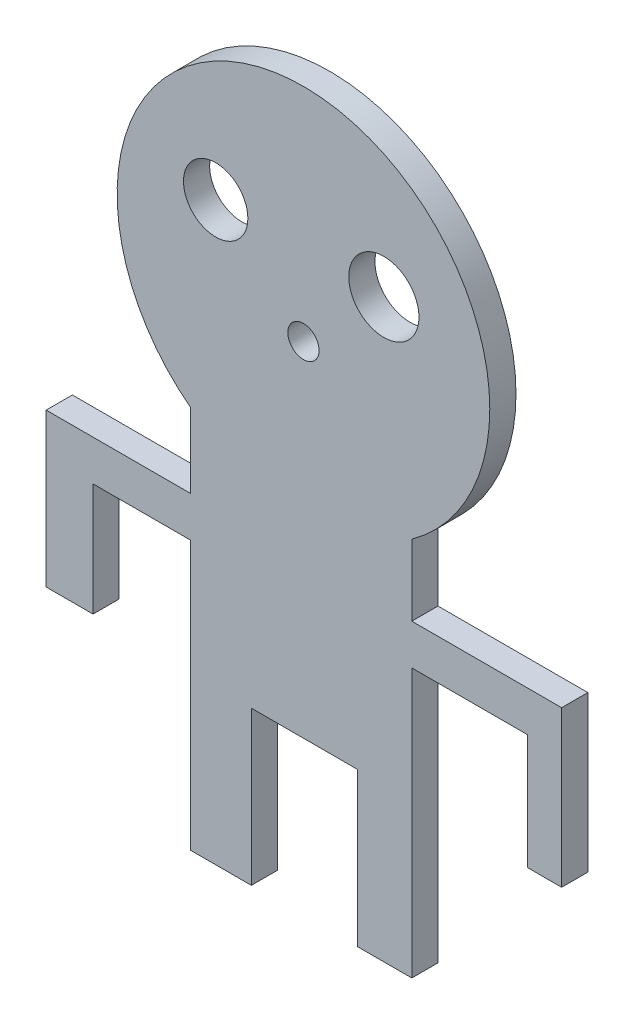
ISO-10303-21;
HEADER;
FILE_DESCRIPTION(('STEP AP214'),'2;1');
FILE_NAME('part.step','',(''),(''),'','','');
FILE_SCHEMA(('AUTOMOTIVE_DESIGN { 1 0 10303 214 1 1 1 1 }'));
ENDSEC;
DATA;
#1=APPLICATION_CONTEXT('core data for automotive mechanical design processes');
#2=APPLICATION_PROTOCOL_DEFINITION('international standard','automotive_design',2000,#1);
#3=PRODUCT_CONTEXT('',#1,'mechanical');
#4=PRODUCT('Part','Part','',(#3));
#5=PRODUCT_RELATED_PRODUCT_CATEGORY('part','',(#4));
#6=PRODUCT_DEFINITION_FORMATION('','',#4);
#7=PRODUCT_DEFINITION_CONTEXT('part definition',#1,'design');
#8=PRODUCT_DEFINITION('design','',#6,#7);
#9=PRODUCT_DEFINITION_SHAPE('','',#8);
#10=(LENGTH_UNIT() NAMED_UNIT(*) SI_UNIT(.MILLI.,.METRE.));
#11=(NAMED_UNIT(*) PLANE_ANGLE_UNIT() SI_UNIT($,.RADIAN.));
#12=(NAMED_UNIT(*) SI_UNIT($,.STERADIAN.) SOLID_ANGLE_UNIT());
#13=UNCERTAINTY_MEASURE_WITH_UNIT(LENGTH_MEASURE(1.E-05),#10,'distance_accuracy_value','');
#14=(GEOMETRIC_REPRESENTATION_CONTEXT(3) GLOBAL_UNCERTAINTY_ASSIGNED_CONTEXT((#13)) GLOBAL_UNIT_ASSIGNED_CONTEXT((#10,
#11,#12)) REPRESENTATION_CONTEXT('',''));
#15=CARTESIAN_POINT('',(0.,0.,0.));
#16=DIRECTION('',(0.,0.,1.));
#17=DIRECTION('',(1.,0.,0.));
#18=AXIS2_PLACEMENT_3D('',#15,#16,#17);
#19=CARTESIAN_POINT('',(0.,0.,10.));
#20=DIRECTION('',(0.,0.,1.));
#21=DIRECTION('',(1.,0.,0.));
#22=AXIS2_PLACEMENT_3D('',#19,#20,#21);
#23=PLANE('',#22);
#24=CARTESIAN_POINT('',(30.6884901447946,16.8513640326862,10.));
#25=DIRECTION('',(0.,0.,1.));
#26=DIRECTION('',(1.,0.,0.));
#27=AXIS2_PLACEMENT_3D('',#24,#25,#26);
#28=CIRCLE('',#27,13.4023424425975);
#29=CARTESIAN_POINT('',(44.0908325873921,16.8513640326862,10.));
#30=VERTEX_POINT('',#29);
#31=EDGE_CURVE('E458',#30,#30,#28,.T.);
#32=ORIENTED_EDGE('',*,*,#31,.F.);
#33=EDGE_LOOP('',(#32));
#34=FACE_BOUND('',#33,.T.);
#35=CARTESIAN_POINT('',(0.,0.,10.));
#36=DIRECTION('',(0.,0.,1.));
#37=DIRECTION('',(1.,0.,0.));
#38=AXIS2_PLACEMENT_3D('',#35,#36,#37);
#39=CIRCLE('',#38,71.1280028052425);
#40=CARTESIAN_POINT('',(41.3499882728577,-57.8737527113727,10.));
#41=VERTEX_POINT('',#40);
#42=CARTESIAN_POINT('',(-43.1667082599356,-56.5316555662771,10.));
#43=VERTEX_POINT('',#42);
#44=EDGE_CURVE('E275',#41,#43,#39,.T.);
#45=ORIENTED_EDGE('',*,*,#44,.T.);
#46=DIRECTION('',(0.,-1.,0.));
#47=VECTOR('',#46,1.);
#48=CARTESIAN_POINT('',(-43.1667082599356,-56.5316555662771,10.));
#49=LINE('',#48,#47);
#50=CARTESIAN_POINT('',(-43.1667082599356,-85.0113060817988,10.));
#51=VERTEX_POINT('',#50);
#52=EDGE_CURVE('E136',#43,#51,#49,.T.);
#53=ORIENTED_EDGE('',*,*,#52,.T.);
#54=DIRECTION('',(-1.,0.,0.));
#55=VECTOR('',#54,1.);
#56=CARTESIAN_POINT('',(-43.1667082599356,-85.0113060817988,10.));
#57=LINE('',#56,#55);
#58=CARTESIAN_POINT('',(-98.2179549040455,-85.0113060817988,10.));
#59=VERTEX_POINT('',#58);
#60=EDGE_CURVE('E344',#51,#59,#57,.T.);
#61=ORIENTED_EDGE('',*,*,#60,.T.);
#62=DIRECTION('',(0.,-1.,0.));
#63=VECTOR('',#62,1.);
#64=CARTESIAN_POINT('',(-98.2179549040455,-85.0113060817988,10.));
#65=LINE('',#64,#63);
#66=CARTESIAN_POINT('',(-98.2179549040455,-143.510977861407,10.));
#67=VERTEX_POINT('',#66);
#68=EDGE_CURVE('E363',#59,#67,#65,.T.);
#69=ORIENTED_EDGE('',*,*,#68,.T.);
#70=DIRECTION('',(1.,0.,0.));
#71=VECTOR('',#70,1.);
#72=CARTESIAN_POINT('',(-98.2179549040455,-143.510977861407,10.));
#73=LINE('',#72,#71);
#74=CARTESIAN_POINT('',(-80.3296255168925,-143.510977861407,10.));
#75=VERTEX_POINT('',#74);
#76=EDGE_CURVE('E359',#67,#75,#73,.T.);
#77=ORIENTED_EDGE('',*,*,#76,.T.);
#78=DIRECTION('',(0.,1.,0.));
#79=VECTOR('',#78,1.);
#80=CARTESIAN_POINT('',(-80.3296255168925,-100.459006623722,10.));
#81=LINE('',#80,#79);
#82=CARTESIAN_POINT('',(-80.3296255168925,-100.459006623722,10.));
#83=VERTEX_POINT('',#82);
#84=EDGE_CURVE('E362',#75,#83,#81,.T.);
#85=ORIENTED_EDGE('',*,*,#84,.T.);
#86=DIRECTION('',(1.,0.,0.));
#87=VECTOR('',#86,1.);
#88=CARTESIAN_POINT('',(-43.1667082599356,-100.459006623722,10.));
#89=LINE('',#88,#87);
#90=CARTESIAN_POINT('',(-43.1667082599356,-100.459006623722,10.));
#91=VERTEX_POINT('',#90);
#92=EDGE_CURVE('E367',#83,#91,#89,.T.);
#93=ORIENTED_EDGE('',*,*,#92,.T.);
#94=DIRECTION('',(0.,-1.,0.));
#95=VECTOR('',#94,1.);
#96=CARTESIAN_POINT('',(-43.1667082599356,-100.459006623722,10.));
#97=LINE('',#96,#95);
#98=CARTESIAN_POINT('',(-43.1667082599356,-202.977586364646,10.));
#99=VERTEX_POINT('',#98);
#100=EDGE_CURVE('E374',#91,#99,#97,.T.);
#101=ORIENTED_EDGE('',*,*,#100,.T.);
#102=DIRECTION('',(1.,0.,0.));
#103=VECTOR('',#102,1.);
#104=CARTESIAN_POINT('',(-43.1667082599356,-202.977586364646,10.));
#105=LINE('',#104,#103);
#106=CARTESIAN_POINT('',(-19.8960802900243,-202.977586364646,10.));
#107=VERTEX_POINT('',#106);
#108=EDGE_CURVE('E377',#99,#107,#105,.T.);
#109=ORIENTED_EDGE('',*,*,#108,.T.);
#110=DIRECTION('',(0.,1.,0.));
#111=VECTOR('',#110,1.);
#112=CARTESIAN_POINT('',(-19.8960802900243,-144.386357681167,10.));
#113=LINE('',#112,#111);
#114=CARTESIAN_POINT('',(-19.8960802900243,-144.386357681167,10.));
#115=VERTEX_POINT('',#114);
#116=EDGE_CURVE('E380',#107,#115,#113,.T.);
#117=ORIENTED_EDGE('',*,*,#116,.T.);
#118=DIRECTION('',(1.,0.,0.));
#119=VECTOR('',#118,1.);
#120=CARTESIAN_POINT('',(-19.8960802900243,-144.386357681167,10.));
#121=LINE('',#120,#119);
#122=CARTESIAN_POINT('',(20.7152621024311,-144.386357681167,10.));
#123=VERTEX_POINT('',#122);
#124=EDGE_CURVE('E383',#115,#123,#121,.T.);
#125=ORIENTED_EDGE('',*,*,#124,.T.);
#126=DIRECTION('',(0.,-1.,0.));
#127=VECTOR('',#126,1.);
#128=CARTESIAN_POINT('',(20.7152621024311,-144.386357681167,10.));
#129=LINE('',#128,#127);
#130=CARTESIAN_POINT('',(20.7152621024311,-202.977586364646,10.));
#131=VERTEX_POINT('',#130);
#132=EDGE_CURVE('E386',#123,#131,#129,.T.);
#133=ORIENTED_EDGE('',*,*,#132,.T.);
#134=DIRECTION('',(1.,0.,0.));
#135=VECTOR('',#134,1.);
#136=CARTESIAN_POINT('',(41.3499882728577,-202.977586364646,10.));
#137=LINE('',#136,#135);
#138=CARTESIAN_POINT('',(41.3499882728577,-202.977586364646,10.));
#139=VERTEX_POINT('',#138);
#140=EDGE_CURVE('E389',#131,#139,#137,.T.);
#141=ORIENTED_EDGE('',*,*,#140,.T.);
#142=DIRECTION('',(0.,1.,0.));
#143=VECTOR('',#142,1.);
#144=CARTESIAN_POINT('',(41.3499882728577,-144.386357681167,10.));
#145=LINE('',#144,#143);
#146=CARTESIAN_POINT('',(41.3499882728577,-100.459006623722,10.));
#147=VERTEX_POINT('',#146);
#148=EDGE_CURVE('E392',#139,#147,#145,.T.);
#149=ORIENTED_EDGE('',*,*,#148,.T.);
#150=DIRECTION('',(1.,0.,0.));
#151=VECTOR('',#150,1.);
#152=CARTESIAN_POINT('',(41.3499882728577,-100.459006623722,10.));
#153=LINE('',#152,#151);
#154=CARTESIAN_POINT('',(85.5000225856338,-100.459006623722,10.));
#155=VERTEX_POINT('',#154);
#156=EDGE_CURVE('E395',#147,#155,#153,.T.);
#157=ORIENTED_EDGE('',*,*,#156,.T.);
#158=DIRECTION('',(0.,-1.,0.));
#159=VECTOR('',#158,1.);
#160=CARTESIAN_POINT('',(85.5000225856338,-100.459006623722,10.));
#161=LINE('',#160,#159);
#162=CARTESIAN_POINT('',(85.5000225856338,-144.386357681167,10.));
#163=VERTEX_POINT('',#162);
#164=EDGE_CURVE('E398',#155,#163,#161,.T.);
#165=ORIENTED_EDGE('',*,*,#164,.T.);
#166=DIRECTION('',(1.,0.,0.));
#167=VECTOR('',#166,1.);
#168=CARTESIAN_POINT('',(98.5536683546373,-144.386357681167,10.));
#169=LINE('',#168,#167);
#170=CARTESIAN_POINT('',(98.5536683546373,-144.386357681167,10.));
#171=VERTEX_POINT('',#170);
#172=EDGE_CURVE('E191',#163,#171,#169,.T.);
#173=ORIENTED_EDGE('',*,*,#172,.T.);
#174=DIRECTION('',(0.,1.,0.));
#175=VECTOR('',#174,1.);
#176=CARTESIAN_POINT('',(98.5536683546373,-100.459006623722,10.));
#177=LINE('',#176,#175);
#178=CARTESIAN_POINT('',(98.5536683546373,-85.0113060817988,10.));
#179=VERTEX_POINT('',#178);
#180=EDGE_CURVE('E185',#171,#179,#177,.T.);
#181=ORIENTED_EDGE('',*,*,#180,.T.);
#182=DIRECTION('',(-1.,0.,0.));
#183=VECTOR('',#182,1.);
#184=CARTESIAN_POINT('',(41.3499882728577,-85.0113060817988,10.));
#185=LINE('',#184,#183);
#186=CARTESIAN_POINT('',(41.3499882728577,-85.0113060817988,10.));
#187=VERTEX_POINT('',#186);
#188=EDGE_CURVE('E189',#179,#187,#185,.T.);
#189=ORIENTED_EDGE('',*,*,#188,.T.);
#190=DIRECTION('',(0.,1.,0.));
#191=VECTOR('',#190,1.);
#192=CARTESIAN_POINT('',(41.3499882728577,-57.8737527113727,10.));
#193=LINE('',#192,#191);
#194=EDGE_CURVE('E57',#187,#41,#193,.T.);
#195=ORIENTED_EDGE('',*,*,#194,.T.);
#196=EDGE_LOOP('',(#45,#53,#61,#69,#77,#85,#93,#101,#109,#117,#125,#133,#141,#149,#157,#165,
#173,#181,#189,#195));
#197=FACE_BOUND('',#196,.T.);
#198=CARTESIAN_POINT('',(-33.5174208042074,16.8513640326862,10.));
#199=DIRECTION('',(0.,0.,1.));
#200=DIRECTION('',(1.,0.,0.));
#201=AXIS2_PLACEMENT_3D('',#198,#199,#200);
#202=CIRCLE('',#201,12.2880186326441);
#203=CARTESIAN_POINT('',(-21.2294021715633,16.8513640326862,10.));
#204=VERTEX_POINT('',#203);
#205=EDGE_CURVE('E217',#204,#204,#202,.T.);
#206=ORIENTED_EDGE('',*,*,#205,.F.);
#207=EDGE_LOOP('',(#206));
#208=FACE_BOUND('',#207,.T.);
#209=CARTESIAN_POINT('',(0.,-13.2377529065141,10.));
#210=DIRECTION('',(0.,0.,1.));
#211=DIRECTION('',(1.,0.,0.));
#212=AXIS2_PLACEMENT_3D('',#209,#210,#211);
#213=CIRCLE('',#212,5.96665513408762);
#214=CARTESIAN_POINT('',(5.96665513408762,-13.2377529065141,10.));
#215=VERTEX_POINT('',#214);
#216=EDGE_CURVE('E447',#215,#215,#213,.T.);
#217=ORIENTED_EDGE('',*,*,#216,.F.);
#218=EDGE_LOOP('',(#217));
#219=FACE_BOUND('',#218,.T.);
#220=ADVANCED_FACE('F39',(#34,#197,#208,#219),#23,.T.);
#221=CARTESIAN_POINT('',(0.,0.,0.));
#222=DIRECTION('',(0.,0.,1.));
#223=DIRECTION('',(1.,0.,0.));
#224=AXIS2_PLACEMENT_3D('',#221,#222,#223);
#225=PLANE('',#224);
#226=CARTESIAN_POINT('',(0.,0.,0.));
#227=DIRECTION('',(0.,0.,1.));
#228=DIRECTION('',(1.,0.,0.));
#229=AXIS2_PLACEMENT_3D('',#226,#227,#228);
#230=CIRCLE('',#229,71.1280028052425);
#231=CARTESIAN_POINT('',(41.3499882728577,-57.8737527113727,0.));
#232=VERTEX_POINT('',#231);
#233=CARTESIAN_POINT('',(-43.1667082599356,-56.5316555662771,0.));
#234=VERTEX_POINT('',#233);
#235=EDGE_CURVE('E212',#232,#234,#230,.T.);
#236=ORIENTED_EDGE('',*,*,#235,.F.);
#237=DIRECTION('',(0.,1.,0.));
#238=VECTOR('',#237,1.);
#239=CARTESIAN_POINT('',(41.3499882728577,-57.8737527113727,0.));
#240=LINE('',#239,#238);
#241=CARTESIAN_POINT('',(41.3499882728577,-85.0113060817988,0.));
#242=VERTEX_POINT('',#241);
#243=EDGE_CURVE('E128',#242,#232,#240,.T.);
#244=ORIENTED_EDGE('',*,*,#243,.F.);
#245=DIRECTION('',(-1.,0.,0.));
#246=VECTOR('',#245,1.);
#247=CARTESIAN_POINT('',(41.3499882728577,-85.0113060817988,0.));
#248=LINE('',#247,#246);
#249=CARTESIAN_POINT('',(98.5536683546373,-85.0113060817988,0.));
#250=VERTEX_POINT('',#249);
#251=EDGE_CURVE('E122',#250,#242,#248,.T.);
#252=ORIENTED_EDGE('',*,*,#251,.F.);
#253=DIRECTION('',(0.,1.,0.));
#254=VECTOR('',#253,1.);
#255=CARTESIAN_POINT('',(98.5536683546373,-85.0113060817988,0.));
#256=LINE('',#255,#254);
#257=CARTESIAN_POINT('',(98.5536683546373,-144.386357681167,0.));
#258=VERTEX_POINT('',#257);
#259=EDGE_CURVE('E199',#258,#250,#256,.T.);
#260=ORIENTED_EDGE('',*,*,#259,.F.);
#261=DIRECTION('',(1.,0.,0.));
#262=VECTOR('',#261,1.);
#263=CARTESIAN_POINT('',(98.5536683546373,-144.386357681167,0.));
#264=LINE('',#263,#262);
#265=CARTESIAN_POINT('',(85.5000225856338,-144.386357681167,0.));
#266=VERTEX_POINT('',#265);
#267=EDGE_CURVE('E265',#266,#258,#264,.T.);
#268=ORIENTED_EDGE('',*,*,#267,.F.);
#269=DIRECTION('',(0.,-1.,0.));
#270=VECTOR('',#269,1.);
#271=CARTESIAN_POINT('',(85.5000225856338,-100.459006623722,0.));
#272=LINE('',#271,#270);
#273=CARTESIAN_POINT('',(85.5000225856338,-100.459006623722,0.));
#274=VERTEX_POINT('',#273);
#275=EDGE_CURVE('E262',#274,#266,#272,.T.);
#276=ORIENTED_EDGE('',*,*,#275,.F.);
#277=DIRECTION('',(1.,0.,0.));
#278=VECTOR('',#277,1.);
#279=CARTESIAN_POINT('',(41.3499882728577,-100.459006623722,0.));
#280=LINE('',#279,#278);
#281=CARTESIAN_POINT('',(41.3499882728577,-100.459006623722,0.));
#282=VERTEX_POINT('',#281);
#283=EDGE_CURVE('E259',#282,#274,#280,.T.);
#284=ORIENTED_EDGE('',*,*,#283,.F.);
#285=DIRECTION('',(0.,1.,0.));
#286=VECTOR('',#285,1.);
#287=CARTESIAN_POINT('',(41.3499882728577,-100.459006623722,0.));
#288=LINE('',#287,#286);
#289=CARTESIAN_POINT('',(41.3499882728577,-202.977586364646,0.));
#290=VERTEX_POINT('',#289);
#291=EDGE_CURVE('E256',#290,#282,#288,.T.);
#292=ORIENTED_EDGE('',*,*,#291,.F.);
#293=DIRECTION('',(1.,0.,0.));
#294=VECTOR('',#293,1.);
#295=CARTESIAN_POINT('',(41.3499882728577,-202.977586364646,0.));
#296=LINE('',#295,#294);
#297=CARTESIAN_POINT('',(20.7152621024311,-202.977586364646,0.));
#298=VERTEX_POINT('',#297);
#299=EDGE_CURVE('E252',#298,#290,#296,.T.);
#300=ORIENTED_EDGE('',*,*,#299,.F.);
#301=DIRECTION('',(0.,-1.,0.));
#302=VECTOR('',#301,1.);
#303=CARTESIAN_POINT('',(20.7152621024311,-144.386357681167,0.));
#304=LINE('',#303,#302);
#305=CARTESIAN_POINT('',(20.7152621024311,-144.386357681167,0.));
#306=VERTEX_POINT('',#305);
#307=EDGE_CURVE('E249',#306,#298,#304,.T.);
#308=ORIENTED_EDGE('',*,*,#307,.F.);
#309=DIRECTION('',(1.,0.,0.));
#310=VECTOR('',#309,1.);
#311=CARTESIAN_POINT('',(-19.8960802900243,-144.386357681167,0.));
#312=LINE('',#311,#310);
#313=CARTESIAN_POINT('',(-19.8960802900243,-144.386357681167,0.));
#314=VERTEX_POINT('',#313);
#315=EDGE_CURVE('E246',#314,#306,#312,.T.);
#316=ORIENTED_EDGE('',*,*,#315,.F.);
#317=DIRECTION('',(0.,1.,0.));
#318=VECTOR('',#317,1.);
#319=CARTESIAN_POINT('',(-19.8960802900243,-144.386357681167,0.));
#320=LINE('',#319,#318);
#321=CARTESIAN_POINT('',(-19.8960802900243,-202.977586364646,0.));
#322=VERTEX_POINT('',#321);
#323=EDGE_CURVE('E243',#322,#314,#320,.T.);
#324=ORIENTED_EDGE('',*,*,#323,.F.);
#325=DIRECTION('',(1.,0.,0.));
#326=VECTOR('',#325,1.);
#327=CARTESIAN_POINT('',(-43.1667082599356,-202.977586364646,0.));
#328=LINE('',#327,#326);
#329=CARTESIAN_POINT('',(-43.1667082599356,-202.977586364646,0.));
#330=VERTEX_POINT('',#329);
#331=EDGE_CURVE('E240',#330,#322,#328,.T.);
#332=ORIENTED_EDGE('',*,*,#331,.F.);
#333=DIRECTION('',(0.,-1.,0.));
#334=VECTOR('',#333,1.);
#335=CARTESIAN_POINT('',(-43.1667082599356,-144.386357681167,0.));
#336=LINE('',#335,#334);
#337=CARTESIAN_POINT('',(-43.1667082599356,-100.459006623722,0.));
#338=VERTEX_POINT('',#337);
#339=EDGE_CURVE('E237',#338,#330,#336,.T.);
#340=ORIENTED_EDGE('',*,*,#339,.F.);
#341=DIRECTION('',(1.,0.,0.));
#342=VECTOR('',#341,1.);
#343=CARTESIAN_POINT('',(-43.1667082599356,-100.459006623722,0.));
#344=LINE('',#343,#342);
#345=CARTESIAN_POINT('',(-80.3296255168925,-100.459006623722,0.));
#346=VERTEX_POINT('',#345);
#347=EDGE_CURVE('E233',#346,#338,#344,.T.);
#348=ORIENTED_EDGE('',*,*,#347,.F.);
#349=DIRECTION('',(0.,1.,0.));
#350=VECTOR('',#349,1.);
#351=CARTESIAN_POINT('',(-80.3296255168925,-100.459006623722,0.));
#352=LINE('',#351,#350);
#353=CARTESIAN_POINT('',(-80.3296255168925,-143.510977861407,0.));
#354=VERTEX_POINT('',#353);
#355=EDGE_CURVE('E230',#354,#346,#352,.T.);
#356=ORIENTED_EDGE('',*,*,#355,.F.);
#357=DIRECTION('',(1.,0.,0.));
#358=VECTOR('',#357,1.);
#359=CARTESIAN_POINT('',(-98.2179549040455,-143.510977861407,0.));
#360=LINE('',#359,#358);
#361=CARTESIAN_POINT('',(-98.2179549040455,-143.510977861407,0.));
#362=VERTEX_POINT('',#361);
#363=EDGE_CURVE('E227',#362,#354,#360,.T.);
#364=ORIENTED_EDGE('',*,*,#363,.F.);
#365=DIRECTION('',(0.,-1.,0.));
#366=VECTOR('',#365,1.);
#367=CARTESIAN_POINT('',(-98.2179549040455,-100.459006623722,0.));
#368=LINE('',#367,#366);
#369=CARTESIAN_POINT('',(-98.2179549040455,-85.0113060817988,0.));
#370=VERTEX_POINT('',#369);
#371=EDGE_CURVE('E224',#370,#362,#368,.T.);
#372=ORIENTED_EDGE('',*,*,#371,.F.);
#373=DIRECTION('',(-1.,0.,0.));
#374=VECTOR('',#373,1.);
#375=CARTESIAN_POINT('',(-43.1667082599356,-85.0113060817988,0.));
#376=LINE('',#375,#374);
#377=CARTESIAN_POINT('',(-43.1667082599356,-85.0113060817988,0.));
#378=VERTEX_POINT('',#377);
#379=EDGE_CURVE('E220',#378,#370,#376,.T.);
#380=ORIENTED_EDGE('',*,*,#379,.F.);
#381=DIRECTION('',(0.,-1.,0.));
#382=VECTOR('',#381,1.);
#383=CARTESIAN_POINT('',(-43.1667082599356,-56.5316555662771,0.));
#384=LINE('',#383,#382);
#385=EDGE_CURVE('E216',#234,#378,#384,.T.);
#386=ORIENTED_EDGE('',*,*,#385,.F.);
#387=EDGE_LOOP('',(#236,#244,#252,#260,#268,#276,#284,#292,#300,#308,#316,#324,#332,#340,#348,
#356,#364,#372,#380,#386));
#388=FACE_BOUND('',#387,.T.);
#389=CARTESIAN_POINT('',(-33.5174208042074,16.8513640326862,0.));
#390=DIRECTION('',(0.,0.,1.));
#391=DIRECTION('',(1.,0.,0.));
#392=AXIS2_PLACEMENT_3D('',#389,#390,#391);
#393=CIRCLE('',#392,12.2880186326441);
#394=CARTESIAN_POINT('',(-21.2294021715633,16.8513640326862,0.));
#395=VERTEX_POINT('',#394);
#396=EDGE_CURVE('E462',#395,#395,#393,.T.);
#397=ORIENTED_EDGE('',*,*,#396,.T.);
#398=EDGE_LOOP('',(#397));
#399=FACE_BOUND('',#398,.T.);
#400=CARTESIAN_POINT('',(30.6884901447946,16.8513640326862,0.));
#401=DIRECTION('',(0.,0.,1.));
#402=DIRECTION('',(1.,0.,0.));
#403=AXIS2_PLACEMENT_3D('',#400,#401,#402);
#404=CIRCLE('',#403,13.4023424425975);
#405=CARTESIAN_POINT('',(44.0908325873921,16.8513640326862,0.));
#406=VERTEX_POINT('',#405);
#407=EDGE_CURVE('E455',#406,#406,#404,.T.);
#408=ORIENTED_EDGE('',*,*,#407,.T.);
#409=EDGE_LOOP('',(#408));
#410=FACE_BOUND('',#409,.T.);
#411=CARTESIAN_POINT('',(0.,-13.2377529065141,0.));
#412=DIRECTION('',(0.,0.,1.));
#413=DIRECTION('',(1.,0.,0.));
#414=AXIS2_PLACEMENT_3D('',#411,#412,#413);
#415=CIRCLE('',#414,5.96665513408762);
#416=CARTESIAN_POINT('',(5.96665513408762,-13.2377529065141,0.));
#417=VERTEX_POINT('',#416);
#418=EDGE_CURVE('E450',#417,#417,#415,.T.);
#419=ORIENTED_EDGE('',*,*,#418,.T.);
#420=EDGE_LOOP('',(#419));
#421=FACE_BOUND('',#420,.T.);
#422=ADVANCED_FACE('F347',(#388,#399,#410,#421),#225,.F.);
#423=CARTESIAN_POINT('',(0.,0.,10.));
#424=DIRECTION('',(0.,0.,-1.));
#425=DIRECTION('',(-1.,0.,0.));
#426=AXIS2_PLACEMENT_3D('',#423,#424,#425);
#427=CYLINDRICAL_SURFACE('',#426,71.1280028052425);
#428=ORIENTED_EDGE('',*,*,#235,.T.);
#429=DIRECTION('',(0.,0.,-1.));
#430=VECTOR('',#429,1.);
#431=CARTESIAN_POINT('',(-43.1667082599356,-56.5316555662771,10.));
#432=LINE('',#431,#430);
#433=EDGE_CURVE('E11',#43,#234,#432,.T.);
#434=ORIENTED_EDGE('',*,*,#433,.F.);
#435=ORIENTED_EDGE('',*,*,#44,.F.);
#436=DIRECTION('',(0.,0.,-1.));
#437=VECTOR('',#436,1.);
#438=CARTESIAN_POINT('',(41.3499882728577,-57.8737527113727,10.));
#439=LINE('',#438,#437);
#440=EDGE_CURVE('E208',#41,#232,#439,.T.);
#441=ORIENTED_EDGE('',*,*,#440,.T.);
#442=EDGE_LOOP('',(#428,#434,#435,#441));
#443=FACE_BOUND('',#442,.T.);
#444=ADVANCED_FACE('F41',(#443),#427,.T.);
#445=CARTESIAN_POINT('',(-43.1667082599356,-56.5316555662771,10.));
#446=DIRECTION('',(1.,0.,0.));
#447=DIRECTION('',(0.,0.,-1.));
#448=AXIS2_PLACEMENT_3D('',#445,#446,#447);
#449=PLANE('',#448);
#450=ORIENTED_EDGE('',*,*,#385,.T.);
#451=DIRECTION('',(0.,0.,-1.));
#452=VECTOR('',#451,1.);
#453=CARTESIAN_POINT('',(-43.1667082599356,-85.0113060817988,10.));
#454=LINE('',#453,#452);
#455=EDGE_CURVE('E49',#51,#378,#454,.T.);
#456=ORIENTED_EDGE('',*,*,#455,.F.);
#457=ORIENTED_EDGE('',*,*,#52,.F.);
#458=ORIENTED_EDGE('',*,*,#433,.T.);
#459=EDGE_LOOP('',(#450,#456,#457,#458));
#460=FACE_BOUND('',#459,.T.);
#461=ADVANCED_FACE('F654',(#460),#449,.F.);
#462=CARTESIAN_POINT('',(-43.1667082599356,-85.0113060817988,10.));
#463=DIRECTION('',(0.,-1.,0.));
#464=DIRECTION('',(0.,0.,-1.));
#465=AXIS2_PLACEMENT_3D('',#462,#463,#464);
#466=PLANE('',#465);
#467=ORIENTED_EDGE('',*,*,#379,.T.);
#468=DIRECTION('',(0.,0.,-1.));
#469=VECTOR('',#468,1.);
#470=CARTESIAN_POINT('',(-98.2179549040455,-85.0113060817988,10.));
#471=LINE('',#470,#469);
#472=EDGE_CURVE('E334',#59,#370,#471,.T.);
#473=ORIENTED_EDGE('',*,*,#472,.F.);
#474=ORIENTED_EDGE('',*,*,#60,.F.);
#475=ORIENTED_EDGE('',*,*,#455,.T.);
#476=EDGE_LOOP('',(#467,#473,#474,#475));
#477=FACE_BOUND('',#476,.T.);
#478=ADVANCED_FACE('F342',(#477),#466,.F.);
#479=CARTESIAN_POINT('',(-98.2179549040455,-100.459006623722,10.));
#480=DIRECTION('',(1.,0.,0.));
#481=DIRECTION('',(0.,0.,-1.));
#482=AXIS2_PLACEMENT_3D('',#479,#480,#481);
#483=PLANE('',#482);
#484=ORIENTED_EDGE('',*,*,#371,.T.);
#485=DIRECTION('',(0.,0.,-1.));
#486=VECTOR('',#485,1.);
#487=CARTESIAN_POINT('',(-98.2179549040455,-143.510977861407,10.));
#488=LINE('',#487,#486);
#489=EDGE_CURVE('E330',#67,#362,#488,.T.);
#490=ORIENTED_EDGE('',*,*,#489,.F.);
#491=ORIENTED_EDGE('',*,*,#68,.F.);
#492=ORIENTED_EDGE('',*,*,#472,.T.);
#493=EDGE_LOOP('',(#484,#490,#491,#492));
#494=FACE_BOUND('',#493,.T.);
#495=ADVANCED_FACE('F353',(#494),#483,.F.);
#496=CARTESIAN_POINT('',(-98.2179549040455,-143.510977861407,10.));
#497=DIRECTION('',(0.,1.,0.));
#498=DIRECTION('',(0.,0.,1.));
#499=AXIS2_PLACEMENT_3D('',#496,#497,#498);
#500=PLANE('',#499);
#501=ORIENTED_EDGE('',*,*,#363,.T.);
#502=DIRECTION('',(0.,0.,-1.));
#503=VECTOR('',#502,1.);
#504=CARTESIAN_POINT('',(-80.3296255168925,-143.510977861407,10.));
#505=LINE('',#504,#503);
#506=EDGE_CURVE('E326',#75,#354,#505,.T.);
#507=ORIENTED_EDGE('',*,*,#506,.F.);
#508=ORIENTED_EDGE('',*,*,#76,.F.);
#509=ORIENTED_EDGE('',*,*,#489,.T.);
#510=EDGE_LOOP('',(#501,#507,#508,#509));
#511=FACE_BOUND('',#510,.T.);
#512=ADVANCED_FACE('F357',(#511),#500,.F.);
#513=CARTESIAN_POINT('',(-80.3296255168925,-100.459006623722,10.));
#514=DIRECTION('',(-1.,0.,0.));
#515=DIRECTION('',(0.,0.,1.));
#516=AXIS2_PLACEMENT_3D('',#513,#514,#515);
#517=PLANE('',#516);
#518=ORIENTED_EDGE('',*,*,#355,.T.);
#519=DIRECTION('',(0.,0.,-1.));
#520=VECTOR('',#519,1.);
#521=CARTESIAN_POINT('',(-80.3296255168925,-100.459006623722,10.));
#522=LINE('',#521,#520);
#523=EDGE_CURVE('E322',#83,#346,#522,.T.);
#524=ORIENTED_EDGE('',*,*,#523,.F.);
#525=ORIENTED_EDGE('',*,*,#84,.F.);
#526=ORIENTED_EDGE('',*,*,#506,.T.);
#527=EDGE_LOOP('',(#518,#524,#525,#526));
#528=FACE_BOUND('',#527,.T.);
#529=ADVANCED_FACE('F618',(#528),#517,.F.);
#530=CARTESIAN_POINT('',(-43.1667082599356,-100.459006623722,10.));
#531=DIRECTION('',(0.,1.,0.));
#532=DIRECTION('',(0.,0.,1.));
#533=AXIS2_PLACEMENT_3D('',#530,#531,#532);
#534=PLANE('',#533);
#535=ORIENTED_EDGE('',*,*,#347,.T.);
#536=DIRECTION('',(0.,0.,-1.));
#537=VECTOR('',#536,1.);
#538=CARTESIAN_POINT('',(-43.1667082599356,-100.459006623722,10.));
#539=LINE('',#538,#537);
#540=EDGE_CURVE('E318',#91,#338,#539,.T.);
#541=ORIENTED_EDGE('',*,*,#540,.F.);
#542=ORIENTED_EDGE('',*,*,#92,.F.);
#543=ORIENTED_EDGE('',*,*,#523,.T.);
#544=EDGE_LOOP('',(#535,#541,#542,#543));
#545=FACE_BOUND('',#544,.T.);
#546=ADVANCED_FACE('F607',(#545),#534,.F.);
#547=CARTESIAN_POINT('',(-43.1667082599356,-144.386357681167,10.));
#548=DIRECTION('',(1.,0.,0.));
#549=DIRECTION('',(0.,0.,-1.));
#550=AXIS2_PLACEMENT_3D('',#547,#548,#549);
#551=PLANE('',#550);
#552=ORIENTED_EDGE('',*,*,#339,.T.);
#553=DIRECTION('',(0.,0.,-1.));
#554=VECTOR('',#553,1.);
#555=CARTESIAN_POINT('',(-43.1667082599356,-202.977586364646,10.));
#556=LINE('',#555,#554);
#557=EDGE_CURVE('E314',#99,#330,#556,.T.);
#558=ORIENTED_EDGE('',*,*,#557,.F.);
#559=ORIENTED_EDGE('',*,*,#100,.F.);
#560=ORIENTED_EDGE('',*,*,#540,.T.);
#561=EDGE_LOOP('',(#552,#558,#559,#560));
#562=FACE_BOUND('',#561,.T.);
#563=ADVANCED_FACE('F597',(#562),#551,.F.);
#564=CARTESIAN_POINT('',(-43.1667082599356,-202.977586364646,10.));
#565=DIRECTION('',(0.,1.,0.));
#566=DIRECTION('',(0.,0.,1.));
#567=AXIS2_PLACEMENT_3D('',#564,#565,#566);
#568=PLANE('',#567);
#569=ORIENTED_EDGE('',*,*,#331,.T.);
#570=DIRECTION('',(0.,0.,-1.));
#571=VECTOR('',#570,1.);
#572=CARTESIAN_POINT('',(-19.8960802900243,-202.977586364646,10.));
#573=LINE('',#572,#571);
#574=EDGE_CURVE('E310',#107,#322,#573,.T.);
#575=ORIENTED_EDGE('',*,*,#574,.F.);
#576=ORIENTED_EDGE('',*,*,#108,.F.);
#577=ORIENTED_EDGE('',*,*,#557,.T.);
#578=EDGE_LOOP('',(#569,#575,#576,#577));
#579=FACE_BOUND('',#578,.T.);
#580=ADVANCED_FACE('F587',(#579),#568,.F.);
#581=CARTESIAN_POINT('',(-19.8960802900243,-144.386357681167,10.));
#582=DIRECTION('',(-1.,0.,0.));
#583=DIRECTION('',(0.,0.,1.));
#584=AXIS2_PLACEMENT_3D('',#581,#582,#583);
#585=PLANE('',#584);
#586=ORIENTED_EDGE('',*,*,#323,.T.);
#587=DIRECTION('',(0.,0.,-1.));
#588=VECTOR('',#587,1.);
#589=CARTESIAN_POINT('',(-19.8960802900243,-144.386357681167,10.));
#590=LINE('',#589,#588);
#591=EDGE_CURVE('E306',#115,#314,#590,.T.);
#592=ORIENTED_EDGE('',*,*,#591,.F.);
#593=ORIENTED_EDGE('',*,*,#116,.F.);
#594=ORIENTED_EDGE('',*,*,#574,.T.);
#595=EDGE_LOOP('',(#586,#592,#593,#594));
#596=FACE_BOUND('',#595,.T.);
#597=ADVANCED_FACE('F577',(#596),#585,.F.);
#598=CARTESIAN_POINT('',(-19.8960802900243,-144.386357681167,10.));
#599=DIRECTION('',(0.,1.,0.));
#600=DIRECTION('',(0.,0.,1.));
#601=AXIS2_PLACEMENT_3D('',#598,#599,#600);
#602=PLANE('',#601);
#603=ORIENTED_EDGE('',*,*,#315,.T.);
#604=DIRECTION('',(0.,0.,-1.));
#605=VECTOR('',#604,1.);
#606=CARTESIAN_POINT('',(20.7152621024311,-144.386357681167,10.));
#607=LINE('',#606,#605);
#608=EDGE_CURVE('E302',#123,#306,#607,.T.);
#609=ORIENTED_EDGE('',*,*,#608,.F.);
#610=ORIENTED_EDGE('',*,*,#124,.F.);
#611=ORIENTED_EDGE('',*,*,#591,.T.);
#612=EDGE_LOOP('',(#603,#609,#610,#611));
#613=FACE_BOUND('',#612,.T.);
#614=ADVANCED_FACE('F567',(#613),#602,.F.);
#615=CARTESIAN_POINT('',(20.7152621024311,-144.386357681167,10.));
#616=DIRECTION('',(1.,0.,0.));
#617=DIRECTION('',(0.,0.,-1.));
#618=AXIS2_PLACEMENT_3D('',#615,#616,#617);
#619=PLANE('',#618);
#620=ORIENTED_EDGE('',*,*,#307,.T.);
#621=DIRECTION('',(0.,0.,-1.));
#622=VECTOR('',#621,1.);
#623=CARTESIAN_POINT('',(20.7152621024311,-202.977586364646,10.));
#624=LINE('',#623,#622);
#625=EDGE_CURVE('E298',#131,#298,#624,.T.);
#626=ORIENTED_EDGE('',*,*,#625,.F.);
#627=ORIENTED_EDGE('',*,*,#132,.F.);
#628=ORIENTED_EDGE('',*,*,#608,.T.);
#629=EDGE_LOOP('',(#620,#626,#627,#628));
#630=FACE_BOUND('',#629,.T.);
#631=ADVANCED_FACE('F557',(#630),#619,.F.);
#632=CARTESIAN_POINT('',(41.3499882728577,-202.977586364646,10.));
#633=DIRECTION('',(0.,1.,0.));
#634=DIRECTION('',(0.,0.,1.));
#635=AXIS2_PLACEMENT_3D('',#632,#633,#634);
#636=PLANE('',#635);
#637=ORIENTED_EDGE('',*,*,#299,.T.);
#638=DIRECTION('',(0.,0.,-1.));
#639=VECTOR('',#638,1.);
#640=CARTESIAN_POINT('',(41.3499882728577,-202.977586364646,10.));
#641=LINE('',#640,#639);
#642=EDGE_CURVE('E294',#139,#290,#641,.T.);
#643=ORIENTED_EDGE('',*,*,#642,.F.);
#644=ORIENTED_EDGE('',*,*,#140,.F.);
#645=ORIENTED_EDGE('',*,*,#625,.T.);
#646=EDGE_LOOP('',(#637,#643,#644,#645));
#647=FACE_BOUND('',#646,.T.);
#648=ADVANCED_FACE('F546',(#647),#636,.F.);
#649=CARTESIAN_POINT('',(41.3499882728577,-100.459006623722,10.));
#650=DIRECTION('',(-1.,0.,0.));
#651=DIRECTION('',(0.,0.,1.));
#652=AXIS2_PLACEMENT_3D('',#649,#650,#651);
#653=PLANE('',#652);
#654=ORIENTED_EDGE('',*,*,#291,.T.);
#655=DIRECTION('',(0.,0.,-1.));
#656=VECTOR('',#655,1.);
#657=CARTESIAN_POINT('',(41.3499882728577,-100.459006623722,10.));
#658=LINE('',#657,#656);
#659=EDGE_CURVE('E290',#147,#282,#658,.T.);
#660=ORIENTED_EDGE('',*,*,#659,.F.);
#661=ORIENTED_EDGE('',*,*,#148,.F.);
#662=ORIENTED_EDGE('',*,*,#642,.T.);
#663=EDGE_LOOP('',(#654,#660,#661,#662));
#664=FACE_BOUND('',#663,.T.);
#665=ADVANCED_FACE('F536',(#664),#653,.F.);
#666=CARTESIAN_POINT('',(41.3499882728577,-100.459006623722,10.));
#667=DIRECTION('',(0.,1.,0.));
#668=DIRECTION('',(0.,0.,1.));
#669=AXIS2_PLACEMENT_3D('',#666,#667,#668);
#670=PLANE('',#669);
#671=ORIENTED_EDGE('',*,*,#283,.T.);
#672=DIRECTION('',(0.,0.,-1.));
#673=VECTOR('',#672,1.);
#674=CARTESIAN_POINT('',(85.5000225856338,-100.459006623722,10.));
#675=LINE('',#674,#673);
#676=EDGE_CURVE('E286',#155,#274,#675,.T.);
#677=ORIENTED_EDGE('',*,*,#676,.F.);
#678=ORIENTED_EDGE('',*,*,#156,.F.);
#679=ORIENTED_EDGE('',*,*,#659,.T.);
#680=EDGE_LOOP('',(#671,#677,#678,#679));
#681=FACE_BOUND('',#680,.T.);
#682=ADVANCED_FACE('F527',(#681),#670,.F.);
#683=CARTESIAN_POINT('',(85.5000225856338,-100.459006623722,10.));
#684=DIRECTION('',(1.,0.,0.));
#685=DIRECTION('',(0.,0.,-1.));
#686=AXIS2_PLACEMENT_3D('',#683,#684,#685);
#687=PLANE('',#686);
#688=ORIENTED_EDGE('',*,*,#275,.T.);
#689=DIRECTION('',(0.,0.,-1.));
#690=VECTOR('',#689,1.);
#691=CARTESIAN_POINT('',(85.5000225856338,-144.386357681167,10.));
#692=LINE('',#691,#690);
#693=EDGE_CURVE('E282',#163,#266,#692,.T.);
#694=ORIENTED_EDGE('',*,*,#693,.F.);
#695=ORIENTED_EDGE('',*,*,#164,.F.);
#696=ORIENTED_EDGE('',*,*,#676,.T.);
#697=EDGE_LOOP('',(#688,#694,#695,#696));
#698=FACE_BOUND('',#697,.T.);
#699=ADVANCED_FACE('F406',(#698),#687,.F.);
#700=CARTESIAN_POINT('',(98.5536683546373,-144.386357681167,10.));
#701=DIRECTION('',(0.,1.,0.));
#702=DIRECTION('',(0.,0.,1.));
#703=AXIS2_PLACEMENT_3D('',#700,#701,#702);
#704=PLANE('',#703);
#705=ORIENTED_EDGE('',*,*,#267,.T.);
#706=DIRECTION('',(0.,0.,-1.));
#707=VECTOR('',#706,1.);
#708=CARTESIAN_POINT('',(98.5536683546373,-144.386357681167,10.));
#709=LINE('',#708,#707);
#710=EDGE_CURVE('E201',#171,#258,#709,.T.);
#711=ORIENTED_EDGE('',*,*,#710,.F.);
#712=ORIENTED_EDGE('',*,*,#172,.F.);
#713=ORIENTED_EDGE('',*,*,#693,.T.);
#714=EDGE_LOOP('',(#705,#711,#712,#713));
#715=FACE_BOUND('',#714,.T.);
#716=ADVANCED_FACE('F410',(#715),#704,.F.);
#717=CARTESIAN_POINT('',(98.5536683546373,-85.0113060817988,10.));
#718=DIRECTION('',(-1.,0.,0.));
#719=DIRECTION('',(0.,0.,1.));
#720=AXIS2_PLACEMENT_3D('',#717,#718,#719);
#721=PLANE('',#720);
#722=ORIENTED_EDGE('',*,*,#259,.T.);
#723=DIRECTION('',(0.,0.,-1.));
#724=VECTOR('',#723,1.);
#725=CARTESIAN_POINT('',(98.5536683546373,-85.0113060817988,10.));
#726=LINE('',#725,#724);
#727=EDGE_CURVE('E197',#179,#250,#726,.T.);
#728=ORIENTED_EDGE('',*,*,#727,.F.);
#729=ORIENTED_EDGE('',*,*,#180,.F.);
#730=ORIENTED_EDGE('',*,*,#710,.T.);
#731=EDGE_LOOP('',(#722,#728,#729,#730));
#732=FACE_BOUND('',#731,.T.);
#733=ADVANCED_FACE('F198',(#732),#721,.F.);
#734=CARTESIAN_POINT('',(41.3499882728577,-85.0113060817988,10.));
#735=DIRECTION('',(0.,-1.,0.));
#736=DIRECTION('',(0.,0.,-1.));
#737=AXIS2_PLACEMENT_3D('',#734,#735,#736);
#738=PLANE('',#737);
#739=ORIENTED_EDGE('',*,*,#251,.T.);
#740=DIRECTION('',(0.,0.,-1.));
#741=VECTOR('',#740,1.);
#742=CARTESIAN_POINT('',(41.3499882728577,-85.0113060817988,10.));
#743=LINE('',#742,#741);
#744=EDGE_CURVE('E202',#187,#242,#743,.T.);
#745=ORIENTED_EDGE('',*,*,#744,.F.);
#746=ORIENTED_EDGE('',*,*,#188,.F.);
#747=ORIENTED_EDGE('',*,*,#727,.T.);
#748=EDGE_LOOP('',(#739,#745,#746,#747));
#749=FACE_BOUND('',#748,.T.);
#750=ADVANCED_FACE('F204',(#749),#738,.F.);
#751=CARTESIAN_POINT('',(41.3499882728577,-57.8737527113727,10.));
#752=DIRECTION('',(-1.,0.,0.));
#753=DIRECTION('',(0.,0.,1.));
#754=AXIS2_PLACEMENT_3D('',#751,#752,#753);
#755=PLANE('',#754);
#756=ORIENTED_EDGE('',*,*,#243,.T.);
#757=ORIENTED_EDGE('',*,*,#440,.F.);
#758=ORIENTED_EDGE('',*,*,#194,.F.);
#759=ORIENTED_EDGE('',*,*,#744,.T.);
#760=EDGE_LOOP('',(#756,#757,#758,#759));
#761=FACE_BOUND('',#760,.T.);
#762=ADVANCED_FACE('F415',(#761),#755,.F.);
#763=CARTESIAN_POINT('',(-33.5174208042074,16.8513640326862,10.));
#764=DIRECTION('',(0.,0.,-1.));
#765=DIRECTION('',(-1.,0.,0.));
#766=AXIS2_PLACEMENT_3D('',#763,#764,#765);
#767=CYLINDRICAL_SURFACE('',#766,12.2880186326441);
#768=ORIENTED_EDGE('',*,*,#205,.T.);
#769=EDGE_LOOP('',(#768));
#770=FACE_BOUND('',#769,.T.);
#771=ORIENTED_EDGE('',*,*,#396,.F.);
#772=EDGE_LOOP('',(#771));
#773=FACE_BOUND('',#772,.T.);
#774=ADVANCED_FACE('F417',(#770,#773),#767,.F.);
#775=CARTESIAN_POINT('',(30.6884901447946,16.8513640326862,10.));
#776=DIRECTION('',(0.,0.,-1.));
#777=DIRECTION('',(-1.,0.,0.));
#778=AXIS2_PLACEMENT_3D('',#775,#776,#777);
#779=CYLINDRICAL_SURFACE('',#778,13.4023424425975);
#780=ORIENTED_EDGE('',*,*,#31,.T.);
#781=EDGE_LOOP('',(#780));
#782=FACE_BOUND('',#781,.T.);
#783=ORIENTED_EDGE('',*,*,#407,.F.);
#784=EDGE_LOOP('',(#783));
#785=FACE_BOUND('',#784,.T.);
#786=ADVANCED_FACE('F423',(#782,#785),#779,.F.);
#787=CARTESIAN_POINT('',(0.,-13.2377529065141,10.));
#788=DIRECTION('',(0.,0.,-1.));
#789=DIRECTION('',(-1.,0.,0.));
#790=AXIS2_PLACEMENT_3D('',#787,#788,#789);
#791=CYLINDRICAL_SURFACE('',#790,5.96665513408762);
#792=ORIENTED_EDGE('',*,*,#216,.T.);
#793=EDGE_LOOP('',(#792));
#794=FACE_BOUND('',#793,.T.);
#795=ORIENTED_EDGE('',*,*,#418,.F.);
#796=EDGE_LOOP('',(#795));
#797=FACE_BOUND('',#796,.T.);
#798=ADVANCED_FACE('F438',(#794,#797),#791,.F.);
#799=CLOSED_SHELL('',(#220,#422,#444,#461,#478,#495,#512,#529,#546,#563,#580,#597,#614,#631,
#648,#665,#682,#699,#716,#733,#750,#762,#774,#786,#798));
#800=MANIFOLD_SOLID_BREP('B2',#799);
#801=ADVANCED_BREP_SHAPE_REPRESENTATION('',(#18,#800),#14);
#802=SHAPE_DEFINITION_REPRESENTATION(#9,#801);
ENDSEC;
END-ISO-10303-21;
